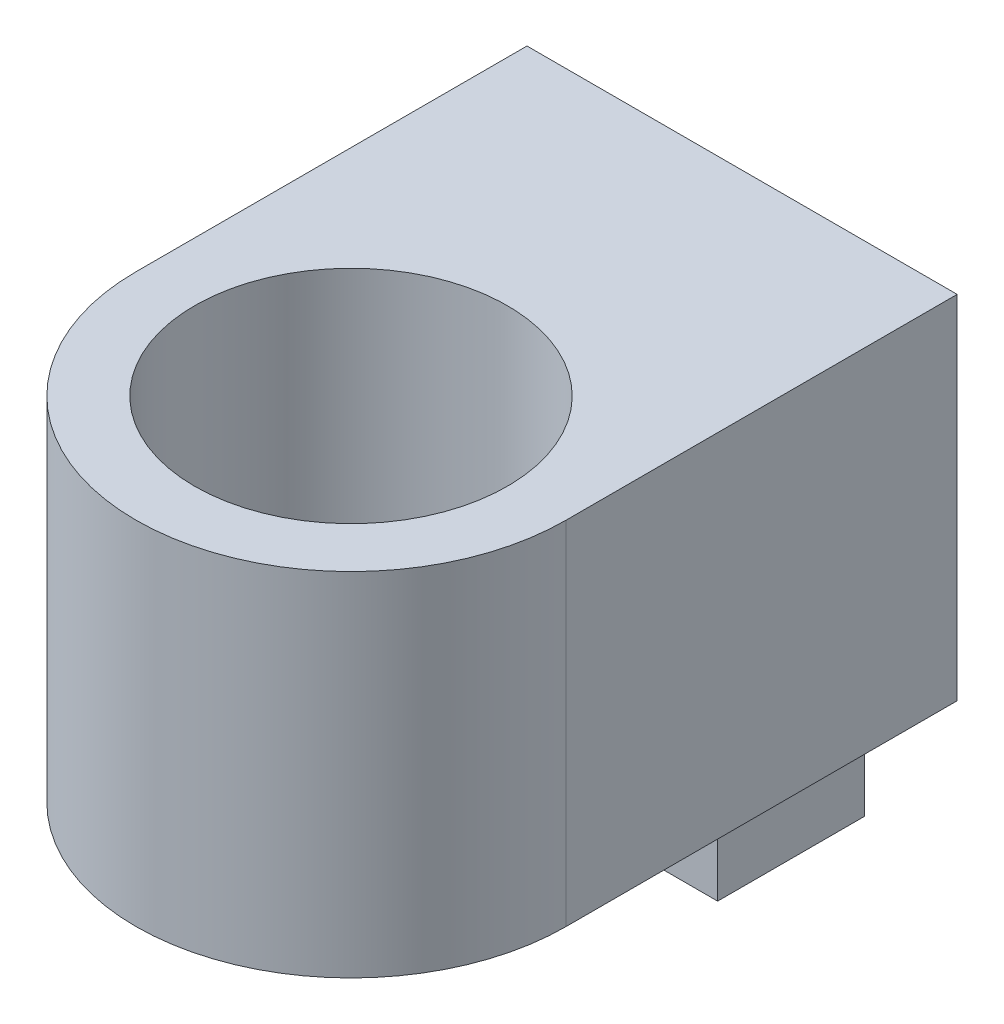
ISO-10303-21;
HEADER;
FILE_DESCRIPTION(('STEP AP214'),'2;1');
FILE_NAME('part.step','',(''),(''),'','','');
FILE_SCHEMA(('AUTOMOTIVE_DESIGN { 1 0 10303 214 1 1 1 1 }'));
ENDSEC;
DATA;
#1=APPLICATION_CONTEXT('core data for automotive mechanical design processes');
#2=APPLICATION_PROTOCOL_DEFINITION('international standard','automotive_design',2000,#1);
#3=PRODUCT_CONTEXT('',#1,'mechanical');
#4=PRODUCT('Part','Part','',(#3));
#5=PRODUCT_RELATED_PRODUCT_CATEGORY('part','',(#4));
#6=PRODUCT_DEFINITION_FORMATION('','',#4);
#7=PRODUCT_DEFINITION_CONTEXT('part definition',#1,'design');
#8=PRODUCT_DEFINITION('design','',#6,#7);
#9=PRODUCT_DEFINITION_SHAPE('','',#8);
#10=(LENGTH_UNIT() NAMED_UNIT(*) SI_UNIT(.MILLI.,.METRE.));
#11=(NAMED_UNIT(*) PLANE_ANGLE_UNIT() SI_UNIT($,.RADIAN.));
#12=(NAMED_UNIT(*) SI_UNIT($,.STERADIAN.) SOLID_ANGLE_UNIT());
#13=UNCERTAINTY_MEASURE_WITH_UNIT(LENGTH_MEASURE(1.E-05),#10,'distance_accuracy_value','');
#14=(GEOMETRIC_REPRESENTATION_CONTEXT(3) GLOBAL_UNCERTAINTY_ASSIGNED_CONTEXT((#13)) GLOBAL_UNIT_ASSIGNED_CONTEXT((#10,
#11,#12)) REPRESENTATION_CONTEXT('',''));
#15=CARTESIAN_POINT('',(0.,0.,0.));
#16=DIRECTION('',(0.,0.,1.));
#17=DIRECTION('',(1.,0.,0.));
#18=AXIS2_PLACEMENT_3D('',#15,#16,#17);
#19=CARTESIAN_POINT('',(0.,0.,0.));
#20=DIRECTION('',(0.,1.,0.));
#21=DIRECTION('',(0.,0.,1.));
#22=AXIS2_PLACEMENT_3D('',#19,#20,#21);
#23=PLANE('',#22);
#24=CARTESIAN_POINT('',(0.,0.,0.));
#25=DIRECTION('',(0.,1.,0.));
#26=DIRECTION('',(0.,0.,1.));
#27=AXIS2_PLACEMENT_3D('',#24,#25,#26);
#28=CIRCLE('',#27,8.);
#29=CARTESIAN_POINT('',(0.,0.,8.));
#30=VERTEX_POINT('',#29);
#31=EDGE_CURVE('E142',#30,#30,#28,.T.);
#32=ORIENTED_EDGE('',*,*,#31,.T.);
#33=EDGE_LOOP('',(#32));
#34=FACE_BOUND('',#33,.T.);
#35=CARTESIAN_POINT('',(0.,0.,0.));
#36=DIRECTION('',(0.,1.,0.));
#37=DIRECTION('',(0.,0.,1.));
#38=AXIS2_PLACEMENT_3D('',#35,#36,#37);
#39=CIRCLE('',#38,11.);
#40=CARTESIAN_POINT('',(-11.,0.,0.));
#41=VERTEX_POINT('',#40);
#42=CARTESIAN_POINT('',(11.,0.,0.));
#43=VERTEX_POINT('',#42);
#44=EDGE_CURVE('E148',#41,#43,#39,.T.);
#45=ORIENTED_EDGE('',*,*,#44,.F.);
#46=DIRECTION('',(0.,0.,1.));
#47=VECTOR('',#46,1.);
#48=CARTESIAN_POINT('',(-11.,0.,0.));
#49=LINE('',#48,#47);
#50=CARTESIAN_POINT('',(-11.,0.,-20.));
#51=VERTEX_POINT('',#50);
#52=EDGE_CURVE('E157',#51,#41,#49,.T.);
#53=ORIENTED_EDGE('',*,*,#52,.F.);
#54=DIRECTION('',(-1.,0.,0.));
#55=VECTOR('',#54,1.);
#56=CARTESIAN_POINT('',(-11.,0.,-20.));
#57=LINE('',#56,#55);
#58=CARTESIAN_POINT('',(11.,0.,-20.));
#59=VERTEX_POINT('',#58);
#60=EDGE_CURVE('E173',#59,#51,#57,.T.);
#61=ORIENTED_EDGE('',*,*,#60,.F.);
#62=DIRECTION('',(0.,0.,-1.));
#63=VECTOR('',#62,1.);
#64=CARTESIAN_POINT('',(11.,0.,0.));
#65=LINE('',#64,#63);
#66=EDGE_CURVE('E170',#43,#59,#65,.T.);
#67=ORIENTED_EDGE('',*,*,#66,.F.);
#68=EDGE_LOOP('',(#45,#53,#61,#67));
#69=FACE_BOUND('',#68,.T.);
#70=DIRECTION('',(0.,0.,-1.));
#71=VECTOR('',#70,1.);
#72=CARTESIAN_POINT('',(-8.75,0.,-10.));
#73=LINE('',#72,#71);
#74=CARTESIAN_POINT('',(-8.75,0.,-10.));
#75=VERTEX_POINT('',#74);
#76=CARTESIAN_POINT('',(-8.75,0.,-17.5));
#77=VERTEX_POINT('',#76);
#78=EDGE_CURVE('E127',#75,#77,#73,.T.);
#79=ORIENTED_EDGE('',*,*,#78,.F.);
#80=DIRECTION('',(-1.,0.,0.));
#81=VECTOR('',#80,1.);
#82=CARTESIAN_POINT('',(-8.75,0.,-10.));
#83=LINE('',#82,#81);
#84=CARTESIAN_POINT('',(8.75,0.,-10.));
#85=VERTEX_POINT('',#84);
#86=EDGE_CURVE('E124',#85,#75,#83,.T.);
#87=ORIENTED_EDGE('',*,*,#86,.F.);
#88=DIRECTION('',(0.,0.,1.));
#89=VECTOR('',#88,1.);
#90=CARTESIAN_POINT('',(8.75,0.,-10.));
#91=LINE('',#90,#89);
#92=CARTESIAN_POINT('',(8.75,0.,-17.5));
#93=VERTEX_POINT('',#92);
#94=EDGE_CURVE('E60',#93,#85,#91,.T.);
#95=ORIENTED_EDGE('',*,*,#94,.F.);
#96=DIRECTION('',(1.,0.,0.));
#97=VECTOR('',#96,1.);
#98=CARTESIAN_POINT('',(-8.75,0.,-17.5));
#99=LINE('',#98,#97);
#100=EDGE_CURVE('E55',#77,#93,#99,.T.);
#101=ORIENTED_EDGE('',*,*,#100,.F.);
#102=EDGE_LOOP('',(#79,#87,#95,#101));
#103=FACE_BOUND('',#102,.T.);
#104=ADVANCED_FACE('F39',(#34,#69,#103),#23,.F.);
#105=CARTESIAN_POINT('',(0.,18.,0.));
#106=DIRECTION('',(0.,1.,0.));
#107=DIRECTION('',(0.,0.,1.));
#108=AXIS2_PLACEMENT_3D('',#105,#106,#107);
#109=PLANE('',#108);
#110=CARTESIAN_POINT('',(0.,18.,0.));
#111=DIRECTION('',(0.,1.,0.));
#112=DIRECTION('',(0.,0.,1.));
#113=AXIS2_PLACEMENT_3D('',#110,#111,#112);
#114=CIRCLE('',#113,11.);
#115=CARTESIAN_POINT('',(-11.,18.,0.));
#116=VERTEX_POINT('',#115);
#117=CARTESIAN_POINT('',(11.,18.,0.));
#118=VERTEX_POINT('',#117);
#119=EDGE_CURVE('E152',#116,#118,#114,.T.);
#120=ORIENTED_EDGE('',*,*,#119,.T.);
#121=DIRECTION('',(0.,0.,-1.));
#122=VECTOR('',#121,1.);
#123=CARTESIAN_POINT('',(11.,18.,0.));
#124=LINE('',#123,#122);
#125=CARTESIAN_POINT('',(11.,18.,-20.));
#126=VERTEX_POINT('',#125);
#127=EDGE_CURVE('E156',#118,#126,#124,.T.);
#128=ORIENTED_EDGE('',*,*,#127,.T.);
#129=DIRECTION('',(-1.,0.,0.));
#130=VECTOR('',#129,1.);
#131=CARTESIAN_POINT('',(-11.,18.,-20.));
#132=LINE('',#131,#130);
#133=CARTESIAN_POINT('',(-11.,18.,-20.));
#134=VERTEX_POINT('',#133);
#135=EDGE_CURVE('E160',#126,#134,#132,.T.);
#136=ORIENTED_EDGE('',*,*,#135,.T.);
#137=DIRECTION('',(0.,0.,1.));
#138=VECTOR('',#137,1.);
#139=CARTESIAN_POINT('',(-11.,18.,0.));
#140=LINE('',#139,#138);
#141=EDGE_CURVE('E163',#134,#116,#140,.T.);
#142=ORIENTED_EDGE('',*,*,#141,.T.);
#143=EDGE_LOOP('',(#120,#128,#136,#142));
#144=FACE_BOUND('',#143,.T.);
#145=CARTESIAN_POINT('',(0.,18.,0.));
#146=DIRECTION('',(0.,1.,0.));
#147=DIRECTION('',(0.,0.,1.));
#148=AXIS2_PLACEMENT_3D('',#145,#146,#147);
#149=CIRCLE('',#148,8.);
#150=CARTESIAN_POINT('',(0.,18.,8.));
#151=VERTEX_POINT('',#150);
#152=EDGE_CURVE('E144',#151,#151,#149,.T.);
#153=ORIENTED_EDGE('',*,*,#152,.F.);
#154=EDGE_LOOP('',(#153));
#155=FACE_BOUND('',#154,.T.);
#156=ADVANCED_FACE('F204',(#144,#155),#109,.T.);
#157=CARTESIAN_POINT('',(0.,18.,0.));
#158=DIRECTION('',(0.,-1.,0.));
#159=DIRECTION('',(0.,0.,-1.));
#160=AXIS2_PLACEMENT_3D('',#157,#158,#159);
#161=CYLINDRICAL_SURFACE('',#160,11.);
#162=ORIENTED_EDGE('',*,*,#44,.T.);
#163=DIRECTION('',(0.,-1.,0.));
#164=VECTOR('',#163,1.);
#165=CARTESIAN_POINT('',(11.,18.,0.));
#166=LINE('',#165,#164);
#167=EDGE_CURVE('E11',#118,#43,#166,.T.);
#168=ORIENTED_EDGE('',*,*,#167,.F.);
#169=ORIENTED_EDGE('',*,*,#119,.F.);
#170=DIRECTION('',(0.,-1.,0.));
#171=VECTOR('',#170,1.);
#172=CARTESIAN_POINT('',(-11.,18.,0.));
#173=LINE('',#172,#171);
#174=EDGE_CURVE('E166',#116,#41,#173,.T.);
#175=ORIENTED_EDGE('',*,*,#174,.T.);
#176=EDGE_LOOP('',(#162,#168,#169,#175));
#177=FACE_BOUND('',#176,.T.);
#178=ADVANCED_FACE('F41',(#177),#161,.T.);
#179=CARTESIAN_POINT('',(11.,18.,0.));
#180=DIRECTION('',(-1.,0.,0.));
#181=DIRECTION('',(0.,0.,1.));
#182=AXIS2_PLACEMENT_3D('',#179,#180,#181);
#183=PLANE('',#182);
#184=ORIENTED_EDGE('',*,*,#66,.T.);
#185=DIRECTION('',(0.,-1.,0.));
#186=VECTOR('',#185,1.);
#187=CARTESIAN_POINT('',(11.,18.,-20.));
#188=LINE('',#187,#186);
#189=EDGE_CURVE('E48',#126,#59,#188,.T.);
#190=ORIENTED_EDGE('',*,*,#189,.F.);
#191=ORIENTED_EDGE('',*,*,#127,.F.);
#192=ORIENTED_EDGE('',*,*,#167,.T.);
#193=EDGE_LOOP('',(#184,#190,#191,#192));
#194=FACE_BOUND('',#193,.T.);
#195=ADVANCED_FACE('F206',(#194),#183,.F.);
#196=CARTESIAN_POINT('',(-11.,18.,-20.));
#197=DIRECTION('',(0.,0.,1.));
#198=DIRECTION('',(1.,0.,0.));
#199=AXIS2_PLACEMENT_3D('',#196,#197,#198);
#200=PLANE('',#199);
#201=CARTESIAN_POINT('',(0.,9.,-20.));
#202=DIRECTION('',(0.,0.,-1.));
#203=DIRECTION('',(-1.,0.,0.));
#204=AXIS2_PLACEMENT_3D('',#201,#202,#203);
#205=CIRCLE('',#204,6.);
#206=CARTESIAN_POINT('',(-6.,9.,-20.));
#207=VERTEX_POINT('',#206);
#208=EDGE_CURVE('E129',#207,#207,#205,.T.);
#209=ORIENTED_EDGE('',*,*,#208,.F.);
#210=EDGE_LOOP('',(#209));
#211=FACE_BOUND('',#210,.T.);
#212=ORIENTED_EDGE('',*,*,#60,.T.);
#213=DIRECTION('',(0.,-1.,0.));
#214=VECTOR('',#213,1.);
#215=CARTESIAN_POINT('',(-11.,18.,-20.));
#216=LINE('',#215,#214);
#217=EDGE_CURVE('E181',#134,#51,#216,.T.);
#218=ORIENTED_EDGE('',*,*,#217,.F.);
#219=ORIENTED_EDGE('',*,*,#135,.F.);
#220=ORIENTED_EDGE('',*,*,#189,.T.);
#221=EDGE_LOOP('',(#212,#218,#219,#220));
#222=FACE_BOUND('',#221,.T.);
#223=ADVANCED_FACE('F190',(#211,#222),#200,.F.);
#224=CARTESIAN_POINT('',(-11.,18.,0.));
#225=DIRECTION('',(1.,0.,0.));
#226=DIRECTION('',(0.,0.,-1.));
#227=AXIS2_PLACEMENT_3D('',#224,#225,#226);
#228=PLANE('',#227);
#229=ORIENTED_EDGE('',*,*,#52,.T.);
#230=ORIENTED_EDGE('',*,*,#174,.F.);
#231=ORIENTED_EDGE('',*,*,#141,.F.);
#232=ORIENTED_EDGE('',*,*,#217,.T.);
#233=EDGE_LOOP('',(#229,#230,#231,#232));
#234=FACE_BOUND('',#233,.T.);
#235=ADVANCED_FACE('F198',(#234),#228,.F.);
#236=CARTESIAN_POINT('',(0.,18.,0.));
#237=DIRECTION('',(0.,-1.,0.));
#238=DIRECTION('',(0.,0.,-1.));
#239=AXIS2_PLACEMENT_3D('',#236,#237,#238);
#240=CYLINDRICAL_SURFACE('',#239,8.);
#241=ORIENTED_EDGE('',*,*,#152,.T.);
#242=EDGE_LOOP('',(#241));
#243=FACE_BOUND('',#242,.T.);
#244=ORIENTED_EDGE('',*,*,#31,.F.);
#245=EDGE_LOOP('',(#244));
#246=FACE_BOUND('',#245,.T.);
#247=ADVANCED_FACE('F224',(#243,#246),#240,.F.);
#248=CARTESIAN_POINT('',(0.,9.,-10.));
#249=DIRECTION('',(0.,0.,-1.));
#250=DIRECTION('',(-1.,0.,0.));
#251=AXIS2_PLACEMENT_3D('',#248,#249,#250);
#252=CYLINDRICAL_SURFACE('',#251,6.);
#253=CARTESIAN_POINT('',(0.,9.,-10.));
#254=DIRECTION('',(0.,0.,-1.));
#255=DIRECTION('',(-1.,0.,0.));
#256=AXIS2_PLACEMENT_3D('',#253,#254,#255);
#257=CIRCLE('',#256,6.);
#258=CARTESIAN_POINT('',(-6.,9.,-10.));
#259=VERTEX_POINT('',#258);
#260=EDGE_CURVE('E134',#259,#259,#257,.T.);
#261=ORIENTED_EDGE('',*,*,#260,.F.);
#262=EDGE_LOOP('',(#261));
#263=FACE_BOUND('',#262,.T.);
#264=ORIENTED_EDGE('',*,*,#208,.T.);
#265=EDGE_LOOP('',(#264));
#266=FACE_BOUND('',#265,.T.);
#267=ADVANCED_FACE('F228',(#263,#266),#252,.F.);
#268=CARTESIAN_POINT('',(0.,9.,-10.));
#269=DIRECTION('',(0.,0.,-1.));
#270=DIRECTION('',(-1.,0.,0.));
#271=AXIS2_PLACEMENT_3D('',#268,#269,#270);
#272=PLANE('',#271);
#273=ORIENTED_EDGE('',*,*,#260,.T.);
#274=EDGE_LOOP('',(#273));
#275=FACE_BOUND('',#274,.T.);
#276=ADVANCED_FACE('F233',(#275),#272,.T.);
#277=CARTESIAN_POINT('',(-8.75,-5.,-10.));
#278=DIRECTION('',(1.,0.,0.));
#279=DIRECTION('',(0.,0.,-1.));
#280=AXIS2_PLACEMENT_3D('',#277,#278,#279);
#281=PLANE('',#280);
#282=ORIENTED_EDGE('',*,*,#78,.T.);
#283=DIRECTION('',(0.,1.,0.));
#284=VECTOR('',#283,1.);
#285=CARTESIAN_POINT('',(-8.75,-5.,-17.5));
#286=LINE('',#285,#284);
#287=CARTESIAN_POINT('',(-8.75,-5.,-17.5));
#288=VERTEX_POINT('',#287);
#289=EDGE_CURVE('E106',#288,#77,#286,.T.);
#290=ORIENTED_EDGE('',*,*,#289,.F.);
#291=DIRECTION('',(0.,0.,-1.));
#292=VECTOR('',#291,1.);
#293=CARTESIAN_POINT('',(-8.75,-5.,-10.));
#294=LINE('',#293,#292);
#295=CARTESIAN_POINT('',(-8.75,-5.,-10.));
#296=VERTEX_POINT('',#295);
#297=EDGE_CURVE('E114',#296,#288,#294,.T.);
#298=ORIENTED_EDGE('',*,*,#297,.F.);
#299=DIRECTION('',(0.,1.,0.));
#300=VECTOR('',#299,1.);
#301=CARTESIAN_POINT('',(-8.75,-5.,-10.));
#302=LINE('',#301,#300);
#303=EDGE_CURVE('E332',#296,#75,#302,.T.);
#304=ORIENTED_EDGE('',*,*,#303,.T.);
#305=EDGE_LOOP('',(#282,#290,#298,#304));
#306=FACE_BOUND('',#305,.T.);
#307=ADVANCED_FACE('F126',(#306),#281,.F.);
#308=CARTESIAN_POINT('',(-8.75,-5.,-17.5));
#309=DIRECTION('',(0.,0.,1.));
#310=DIRECTION('',(1.,0.,0.));
#311=AXIS2_PLACEMENT_3D('',#308,#309,#310);
#312=PLANE('',#311);
#313=ORIENTED_EDGE('',*,*,#100,.T.);
#314=DIRECTION('',(0.,1.,0.));
#315=VECTOR('',#314,1.);
#316=CARTESIAN_POINT('',(8.75,-5.,-17.5));
#317=LINE('',#316,#315);
#318=CARTESIAN_POINT('',(8.75,-5.,-17.5));
#319=VERTEX_POINT('',#318);
#320=EDGE_CURVE('E109',#319,#93,#317,.T.);
#321=ORIENTED_EDGE('',*,*,#320,.F.);
#322=DIRECTION('',(1.,0.,0.));
#323=VECTOR('',#322,1.);
#324=CARTESIAN_POINT('',(-8.75,-5.,-17.5));
#325=LINE('',#324,#323);
#326=EDGE_CURVE('E102',#288,#319,#325,.T.);
#327=ORIENTED_EDGE('',*,*,#326,.F.);
#328=ORIENTED_EDGE('',*,*,#289,.T.);
#329=EDGE_LOOP('',(#313,#321,#327,#328));
#330=FACE_BOUND('',#329,.T.);
#331=ADVANCED_FACE('F104',(#330),#312,.F.);
#332=CARTESIAN_POINT('',(8.75,-5.,-10.));
#333=DIRECTION('',(-1.,0.,0.));
#334=DIRECTION('',(0.,0.,1.));
#335=AXIS2_PLACEMENT_3D('',#332,#333,#334);
#336=PLANE('',#335);
#337=ORIENTED_EDGE('',*,*,#94,.T.);
#338=DIRECTION('',(0.,1.,0.));
#339=VECTOR('',#338,1.);
#340=CARTESIAN_POINT('',(8.75,-5.,-10.));
#341=LINE('',#340,#339);
#342=CARTESIAN_POINT('',(8.75,-5.,-10.));
#343=VERTEX_POINT('',#342);
#344=EDGE_CURVE('E136',#343,#85,#341,.T.);
#345=ORIENTED_EDGE('',*,*,#344,.F.);
#346=DIRECTION('',(0.,0.,1.));
#347=VECTOR('',#346,1.);
#348=CARTESIAN_POINT('',(8.75,-5.,-10.));
#349=LINE('',#348,#347);
#350=EDGE_CURVE('E113',#319,#343,#349,.T.);
#351=ORIENTED_EDGE('',*,*,#350,.F.);
#352=ORIENTED_EDGE('',*,*,#320,.T.);
#353=EDGE_LOOP('',(#337,#345,#351,#352));
#354=FACE_BOUND('',#353,.T.);
#355=ADVANCED_FACE('F245',(#354),#336,.F.);
#356=CARTESIAN_POINT('',(-8.75,-5.,-10.));
#357=DIRECTION('',(0.,0.,-1.));
#358=DIRECTION('',(-1.,0.,0.));
#359=AXIS2_PLACEMENT_3D('',#356,#357,#358);
#360=PLANE('',#359);
#361=ORIENTED_EDGE('',*,*,#86,.T.);
#362=ORIENTED_EDGE('',*,*,#303,.F.);
#363=DIRECTION('',(-1.,0.,0.));
#364=VECTOR('',#363,1.);
#365=CARTESIAN_POINT('',(-8.75,-5.,-10.));
#366=LINE('',#365,#364);
#367=EDGE_CURVE('E119',#343,#296,#366,.T.);
#368=ORIENTED_EDGE('',*,*,#367,.F.);
#369=ORIENTED_EDGE('',*,*,#344,.T.);
#370=EDGE_LOOP('',(#361,#362,#368,#369));
#371=FACE_BOUND('',#370,.T.);
#372=ADVANCED_FACE('F248',(#371),#360,.F.);
#373=CARTESIAN_POINT('',(0.,-5.,0.));
#374=DIRECTION('',(0.,-1.,0.));
#375=DIRECTION('',(0.,0.,-1.));
#376=AXIS2_PLACEMENT_3D('',#373,#374,#375);
#377=PLANE('',#376);
#378=ORIENTED_EDGE('',*,*,#297,.T.);
#379=ORIENTED_EDGE('',*,*,#326,.T.);
#380=ORIENTED_EDGE('',*,*,#350,.T.);
#381=ORIENTED_EDGE('',*,*,#367,.T.);
#382=EDGE_LOOP('',(#378,#379,#380,#381));
#383=FACE_BOUND('',#382,.T.);
#384=ADVANCED_FACE('F117',(#383),#377,.T.);
#385=CLOSED_SHELL('',(#104,#156,#178,#195,#223,#235,#247,#267,#276,#307,#331,#355,#372,#384));
#386=MANIFOLD_SOLID_BREP('B2',#385);
#387=ADVANCED_BREP_SHAPE_REPRESENTATION('',(#18,#386),#14);
#388=SHAPE_DEFINITION_REPRESENTATION(#9,#387);
ENDSEC;
END-ISO-10303-21;
